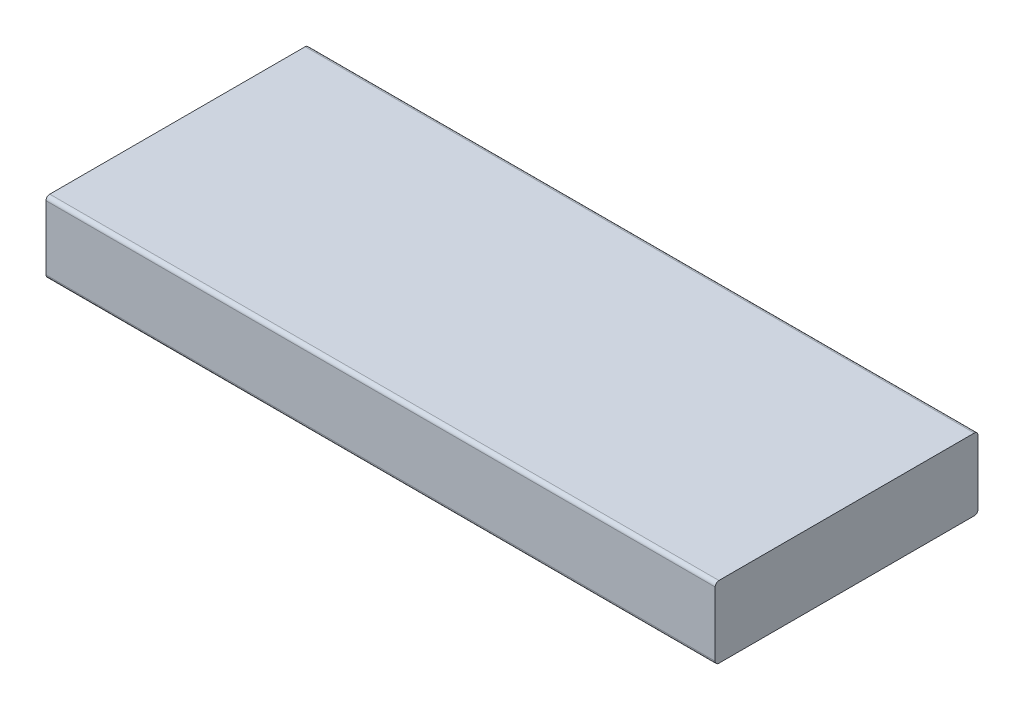
ISO-10303-21;
HEADER;
FILE_DESCRIPTION(('STEP AP214'),'2;1');
FILE_NAME('part.step','',(''),(''),'','','');
FILE_SCHEMA(('AUTOMOTIVE_DESIGN { 1 0 10303 214 1 1 1 1 }'));
ENDSEC;
DATA;
#1=APPLICATION_CONTEXT('core data for automotive mechanical design processes');
#2=APPLICATION_PROTOCOL_DEFINITION('international standard','automotive_design',2000,#1);
#3=PRODUCT_CONTEXT('',#1,'mechanical');
#4=PRODUCT('Part','Part','',(#3));
#5=PRODUCT_RELATED_PRODUCT_CATEGORY('part','',(#4));
#6=PRODUCT_DEFINITION_FORMATION('','',#4);
#7=PRODUCT_DEFINITION_CONTEXT('part definition',#1,'design');
#8=PRODUCT_DEFINITION('design','',#6,#7);
#9=PRODUCT_DEFINITION_SHAPE('','',#8);
#10=(LENGTH_UNIT() NAMED_UNIT(*) SI_UNIT(.MILLI.,.METRE.));
#11=(NAMED_UNIT(*) PLANE_ANGLE_UNIT() SI_UNIT($,.RADIAN.));
#12=(NAMED_UNIT(*) SI_UNIT($,.STERADIAN.) SOLID_ANGLE_UNIT());
#13=UNCERTAINTY_MEASURE_WITH_UNIT(LENGTH_MEASURE(1.E-05),#10,'distance_accuracy_value','');
#14=(GEOMETRIC_REPRESENTATION_CONTEXT(3) GLOBAL_UNCERTAINTY_ASSIGNED_CONTEXT((#13)) GLOBAL_UNIT_ASSIGNED_CONTEXT((#10,
#11,#12)) REPRESENTATION_CONTEXT('',''));
#15=CARTESIAN_POINT('',(0.,0.,0.));
#16=DIRECTION('',(0.,0.,1.));
#17=DIRECTION('',(1.,0.,0.));
#18=AXIS2_PLACEMENT_3D('',#15,#16,#17);
#19=CARTESIAN_POINT('',(355.6,-19.05,-69.85));
#20=DIRECTION('',(0.,0.,1.));
#21=DIRECTION('',(1.,0.,0.));
#22=AXIS2_PLACEMENT_3D('',#19,#20,#21);
#23=PLANE('',#22);
#24=DIRECTION('',(0.,1.,0.));
#25=VECTOR('',#24,1.);
#26=CARTESIAN_POINT('',(0.,-19.05,-69.85));
#27=LINE('',#26,#25);
#28=CARTESIAN_POINT('',(0.,-17.05,-69.85));
#29=VERTEX_POINT('',#28);
#30=CARTESIAN_POINT('',(0.,17.05,-69.85));
#31=VERTEX_POINT('',#30);
#32=EDGE_CURVE('E129',#29,#31,#27,.T.);
#33=ORIENTED_EDGE('',*,*,#32,.T.);
#34=DIRECTION('',(-1.,0.,0.));
#35=VECTOR('',#34,1.);
#36=CARTESIAN_POINT('',(355.6,17.05,-69.85));
#37=LINE('',#36,#35);
#38=CARTESIAN_POINT('',(355.6,17.05,-69.85));
#39=VERTEX_POINT('',#38);
#40=EDGE_CURVE('E152',#31,#39,#37,.F.);
#41=ORIENTED_EDGE('',*,*,#40,.T.);
#42=DIRECTION('',(0.,1.,0.));
#43=VECTOR('',#42,1.);
#44=CARTESIAN_POINT('',(355.6,-19.05,-69.85));
#45=LINE('',#44,#43);
#46=CARTESIAN_POINT('',(355.6,-17.05,-69.85));
#47=VERTEX_POINT('',#46);
#48=EDGE_CURVE('E127',#47,#39,#45,.T.);
#49=ORIENTED_EDGE('',*,*,#48,.F.);
#50=DIRECTION('',(-1.,0.,0.));
#51=VECTOR('',#50,1.);
#52=CARTESIAN_POINT('',(355.6,-17.05,-69.85));
#53=LINE('',#52,#51);
#54=EDGE_CURVE('E149',#47,#29,#53,.T.);
#55=ORIENTED_EDGE('',*,*,#54,.T.);
#56=EDGE_LOOP('',(#33,#41,#49,#55));
#57=FACE_BOUND('',#56,.T.);
#58=ADVANCED_FACE('F34',(#57),#23,.F.);
#59=CARTESIAN_POINT('',(355.6,19.05,69.85));
#60=DIRECTION('',(0.,-1.,0.));
#61=DIRECTION('',(0.,0.,-1.));
#62=AXIS2_PLACEMENT_3D('',#59,#60,#61);
#63=PLANE('',#62);
#64=DIRECTION('',(0.,0.,1.));
#65=VECTOR('',#64,1.);
#66=CARTESIAN_POINT('',(0.,19.05,69.85));
#67=LINE('',#66,#65);
#68=CARTESIAN_POINT('',(0.,19.05,-67.85));
#69=VERTEX_POINT('',#68);
#70=CARTESIAN_POINT('',(0.,19.05,67.85));
#71=VERTEX_POINT('',#70);
#72=EDGE_CURVE('E125',#69,#71,#67,.T.);
#73=ORIENTED_EDGE('',*,*,#72,.T.);
#74=DIRECTION('',(-1.,0.,0.));
#75=VECTOR('',#74,1.);
#76=CARTESIAN_POINT('',(355.6,19.05,67.85));
#77=LINE('',#76,#75);
#78=CARTESIAN_POINT('',(355.6,19.05,67.85));
#79=VERTEX_POINT('',#78);
#80=EDGE_CURVE('E104',#71,#79,#77,.F.);
#81=ORIENTED_EDGE('',*,*,#80,.T.);
#82=DIRECTION('',(0.,0.,1.));
#83=VECTOR('',#82,1.);
#84=CARTESIAN_POINT('',(355.6,19.05,69.85));
#85=LINE('',#84,#83);
#86=CARTESIAN_POINT('',(355.6,19.05,-67.85));
#87=VERTEX_POINT('',#86);
#88=EDGE_CURVE('E168',#87,#79,#85,.T.);
#89=ORIENTED_EDGE('',*,*,#88,.F.);
#90=DIRECTION('',(-1.,0.,0.));
#91=VECTOR('',#90,1.);
#92=CARTESIAN_POINT('',(355.6,19.05,-67.85));
#93=LINE('',#92,#91);
#94=EDGE_CURVE('E109',#87,#69,#93,.T.);
#95=ORIENTED_EDGE('',*,*,#94,.T.);
#96=EDGE_LOOP('',(#73,#81,#89,#95));
#97=FACE_BOUND('',#96,.T.);
#98=ADVANCED_FACE('F185',(#97),#63,.F.);
#99=CARTESIAN_POINT('',(355.6,-19.05,69.85));
#100=DIRECTION('',(0.,0.,-1.));
#101=DIRECTION('',(-1.,0.,0.));
#102=AXIS2_PLACEMENT_3D('',#99,#100,#101);
#103=PLANE('',#102);
#104=DIRECTION('',(0.,-1.,0.));
#105=VECTOR('',#104,1.);
#106=CARTESIAN_POINT('',(355.6,-19.05,69.85));
#107=LINE('',#106,#105);
#108=CARTESIAN_POINT('',(355.6,17.05,69.85));
#109=VERTEX_POINT('',#108);
#110=CARTESIAN_POINT('',(355.6,-17.05,69.85));
#111=VERTEX_POINT('',#110);
#112=EDGE_CURVE('E118',#109,#111,#107,.T.);
#113=ORIENTED_EDGE('',*,*,#112,.F.);
#114=DIRECTION('',(-1.,0.,0.));
#115=VECTOR('',#114,1.);
#116=CARTESIAN_POINT('',(355.6,17.05,69.85));
#117=LINE('',#116,#115);
#118=CARTESIAN_POINT('',(0.,17.05,69.85));
#119=VERTEX_POINT('',#118);
#120=EDGE_CURVE('E103',#109,#119,#117,.T.);
#121=ORIENTED_EDGE('',*,*,#120,.T.);
#122=DIRECTION('',(0.,-1.,0.));
#123=VECTOR('',#122,1.);
#124=CARTESIAN_POINT('',(0.,-19.05,69.85));
#125=LINE('',#124,#123);
#126=CARTESIAN_POINT('',(0.,-17.05,69.85));
#127=VERTEX_POINT('',#126);
#128=EDGE_CURVE('E116',#119,#127,#125,.T.);
#129=ORIENTED_EDGE('',*,*,#128,.T.);
#130=DIRECTION('',(-1.,0.,0.));
#131=VECTOR('',#130,1.);
#132=CARTESIAN_POINT('',(355.6,-17.05,69.85));
#133=LINE('',#132,#131);
#134=EDGE_CURVE('E120',#127,#111,#133,.F.);
#135=ORIENTED_EDGE('',*,*,#134,.T.);
#136=EDGE_LOOP('',(#113,#121,#129,#135));
#137=FACE_BOUND('',#136,.T.);
#138=ADVANCED_FACE('F115',(#137),#103,.F.);
#139=CARTESIAN_POINT('',(355.6,-19.05,69.85));
#140=DIRECTION('',(0.,1.,0.));
#141=DIRECTION('',(0.,0.,1.));
#142=AXIS2_PLACEMENT_3D('',#139,#140,#141);
#143=PLANE('',#142);
#144=DIRECTION('',(0.,0.,-1.));
#145=VECTOR('',#144,1.);
#146=CARTESIAN_POINT('',(0.,-19.05,69.85));
#147=LINE('',#146,#145);
#148=CARTESIAN_POINT('',(0.,-19.05,67.85));
#149=VERTEX_POINT('',#148);
#150=CARTESIAN_POINT('',(0.,-19.05,-67.85));
#151=VERTEX_POINT('',#150);
#152=EDGE_CURVE('E124',#149,#151,#147,.T.);
#153=ORIENTED_EDGE('',*,*,#152,.T.);
#154=DIRECTION('',(-1.,0.,0.));
#155=VECTOR('',#154,1.);
#156=CARTESIAN_POINT('',(355.6,-19.05,-67.85));
#157=LINE('',#156,#155);
#158=CARTESIAN_POINT('',(355.6,-19.05,-67.85));
#159=VERTEX_POINT('',#158);
#160=EDGE_CURVE('E11',#151,#159,#157,.F.);
#161=ORIENTED_EDGE('',*,*,#160,.T.);
#162=DIRECTION('',(0.,0.,-1.));
#163=VECTOR('',#162,1.);
#164=CARTESIAN_POINT('',(355.6,-19.05,69.85));
#165=LINE('',#164,#163);
#166=CARTESIAN_POINT('',(355.6,-19.05,67.85));
#167=VERTEX_POINT('',#166);
#168=EDGE_CURVE('E133',#167,#159,#165,.T.);
#169=ORIENTED_EDGE('',*,*,#168,.F.);
#170=DIRECTION('',(-1.,0.,0.));
#171=VECTOR('',#170,1.);
#172=CARTESIAN_POINT('',(355.6,-19.05,67.85));
#173=LINE('',#172,#171);
#174=EDGE_CURVE('E42',#167,#149,#173,.T.);
#175=ORIENTED_EDGE('',*,*,#174,.T.);
#176=EDGE_LOOP('',(#153,#161,#169,#175));
#177=FACE_BOUND('',#176,.T.);
#178=ADVANCED_FACE('F155',(#177),#143,.F.);
#179=CARTESIAN_POINT('',(355.6,0.,0.));
#180=DIRECTION('',(-1.,0.,0.));
#181=DIRECTION('',(0.,0.,1.));
#182=AXIS2_PLACEMENT_3D('',#179,#180,#181);
#183=PLANE('',#182);
#184=ORIENTED_EDGE('',*,*,#88,.T.);
#185=CARTESIAN_POINT('',(355.6,17.05,67.85));
#186=DIRECTION('',(-1.,0.,0.));
#187=DIRECTION('',(0.,0.,1.));
#188=AXIS2_PLACEMENT_3D('',#185,#186,#187);
#189=CIRCLE('',#188,2.);
#190=EDGE_CURVE('E147',#79,#109,#189,.F.);
#191=ORIENTED_EDGE('',*,*,#190,.T.);
#192=ORIENTED_EDGE('',*,*,#112,.T.);
#193=CARTESIAN_POINT('',(355.6,-17.05,67.85));
#194=DIRECTION('',(-1.,0.,0.));
#195=DIRECTION('',(0.,0.,1.));
#196=AXIS2_PLACEMENT_3D('',#193,#194,#195);
#197=CIRCLE('',#196,2.);
#198=EDGE_CURVE('E54',#111,#167,#197,.F.);
#199=ORIENTED_EDGE('',*,*,#198,.T.);
#200=ORIENTED_EDGE('',*,*,#168,.T.);
#201=CARTESIAN_POINT('',(355.6,-17.05,-67.85));
#202=DIRECTION('',(-1.,0.,0.));
#203=DIRECTION('',(0.,0.,1.));
#204=AXIS2_PLACEMENT_3D('',#201,#202,#203);
#205=CIRCLE('',#204,2.);
#206=EDGE_CURVE('E143',#159,#47,#205,.F.);
#207=ORIENTED_EDGE('',*,*,#206,.T.);
#208=ORIENTED_EDGE('',*,*,#48,.T.);
#209=CARTESIAN_POINT('',(355.6,17.05,-67.85));
#210=DIRECTION('',(-1.,0.,0.));
#211=DIRECTION('',(0.,0.,1.));
#212=AXIS2_PLACEMENT_3D('',#209,#210,#211);
#213=CIRCLE('',#212,2.);
#214=EDGE_CURVE('E145',#39,#87,#213,.F.);
#215=ORIENTED_EDGE('',*,*,#214,.T.);
#216=EDGE_LOOP('',(#184,#191,#192,#199,#200,#207,#208,#215));
#217=FACE_BOUND('',#216,.T.);
#218=ADVANCED_FACE('F174',(#217),#183,.F.);
#219=CARTESIAN_POINT('',(0.,0.,0.));
#220=DIRECTION('',(-1.,0.,0.));
#221=DIRECTION('',(0.,0.,1.));
#222=AXIS2_PLACEMENT_3D('',#219,#220,#221);
#223=PLANE('',#222);
#224=ORIENTED_EDGE('',*,*,#128,.F.);
#225=CARTESIAN_POINT('',(0.,17.05,67.85));
#226=DIRECTION('',(-1.,0.,0.));
#227=DIRECTION('',(0.,0.,1.));
#228=AXIS2_PLACEMENT_3D('',#225,#226,#227);
#229=CIRCLE('',#228,2.);
#230=EDGE_CURVE('E99',#119,#71,#229,.T.);
#231=ORIENTED_EDGE('',*,*,#230,.T.);
#232=ORIENTED_EDGE('',*,*,#72,.F.);
#233=CARTESIAN_POINT('',(0.,17.05,-67.85));
#234=DIRECTION('',(-1.,0.,0.));
#235=DIRECTION('',(0.,0.,1.));
#236=AXIS2_PLACEMENT_3D('',#233,#234,#235);
#237=CIRCLE('',#236,2.);
#238=EDGE_CURVE('E110',#69,#31,#237,.T.);
#239=ORIENTED_EDGE('',*,*,#238,.T.);
#240=ORIENTED_EDGE('',*,*,#32,.F.);
#241=CARTESIAN_POINT('',(0.,-17.05,-67.85));
#242=DIRECTION('',(-1.,0.,0.));
#243=DIRECTION('',(0.,0.,1.));
#244=AXIS2_PLACEMENT_3D('',#241,#242,#243);
#245=CIRCLE('',#244,2.);
#246=EDGE_CURVE('E136',#29,#151,#245,.T.);
#247=ORIENTED_EDGE('',*,*,#246,.T.);
#248=ORIENTED_EDGE('',*,*,#152,.F.);
#249=CARTESIAN_POINT('',(0.,-17.05,67.85));
#250=DIRECTION('',(-1.,0.,0.));
#251=DIRECTION('',(0.,0.,1.));
#252=AXIS2_PLACEMENT_3D('',#249,#250,#251);
#253=CIRCLE('',#252,2.);
#254=EDGE_CURVE('E119',#149,#127,#253,.T.);
#255=ORIENTED_EDGE('',*,*,#254,.T.);
#256=EDGE_LOOP('',(#224,#231,#232,#239,#240,#247,#248,#255));
#257=FACE_BOUND('',#256,.T.);
#258=ADVANCED_FACE('F122',(#257),#223,.T.);
#259=CARTESIAN_POINT('',(355.6,17.05,67.85));
#260=DIRECTION('',(-1.,0.,0.));
#261=DIRECTION('',(0.,0.,1.));
#262=AXIS2_PLACEMENT_3D('',#259,#260,#261);
#263=CYLINDRICAL_SURFACE('',#262,2.);
#264=ORIENTED_EDGE('',*,*,#190,.F.);
#265=ORIENTED_EDGE('',*,*,#80,.F.);
#266=ORIENTED_EDGE('',*,*,#230,.F.);
#267=ORIENTED_EDGE('',*,*,#120,.F.);
#268=EDGE_LOOP('',(#264,#265,#266,#267));
#269=FACE_BOUND('',#268,.T.);
#270=ADVANCED_FACE('F102',(#269),#263,.T.);
#271=CARTESIAN_POINT('',(355.6,17.05,-67.85));
#272=DIRECTION('',(-1.,0.,0.));
#273=DIRECTION('',(0.,0.,1.));
#274=AXIS2_PLACEMENT_3D('',#271,#272,#273);
#275=CYLINDRICAL_SURFACE('',#274,2.);
#276=ORIENTED_EDGE('',*,*,#214,.F.);
#277=ORIENTED_EDGE('',*,*,#40,.F.);
#278=ORIENTED_EDGE('',*,*,#238,.F.);
#279=ORIENTED_EDGE('',*,*,#94,.F.);
#280=EDGE_LOOP('',(#276,#277,#278,#279));
#281=FACE_BOUND('',#280,.T.);
#282=ADVANCED_FACE('F196',(#281),#275,.T.);
#283=CARTESIAN_POINT('',(355.6,-17.05,-67.85));
#284=DIRECTION('',(-1.,0.,0.));
#285=DIRECTION('',(0.,0.,1.));
#286=AXIS2_PLACEMENT_3D('',#283,#284,#285);
#287=CYLINDRICAL_SURFACE('',#286,2.);
#288=ORIENTED_EDGE('',*,*,#206,.F.);
#289=ORIENTED_EDGE('',*,*,#160,.F.);
#290=ORIENTED_EDGE('',*,*,#246,.F.);
#291=ORIENTED_EDGE('',*,*,#54,.F.);
#292=EDGE_LOOP('',(#288,#289,#290,#291));
#293=FACE_BOUND('',#292,.T.);
#294=ADVANCED_FACE('F162',(#293),#287,.T.);
#295=CARTESIAN_POINT('',(355.6,-17.05,67.85));
#296=DIRECTION('',(-1.,0.,0.));
#297=DIRECTION('',(0.,0.,1.));
#298=AXIS2_PLACEMENT_3D('',#295,#296,#297);
#299=CYLINDRICAL_SURFACE('',#298,2.);
#300=ORIENTED_EDGE('',*,*,#198,.F.);
#301=ORIENTED_EDGE('',*,*,#134,.F.);
#302=ORIENTED_EDGE('',*,*,#254,.F.);
#303=ORIENTED_EDGE('',*,*,#174,.F.);
#304=EDGE_LOOP('',(#300,#301,#302,#303));
#305=FACE_BOUND('',#304,.T.);
#306=ADVANCED_FACE('F36',(#305),#299,.T.);
#307=CLOSED_SHELL('',(#58,#98,#138,#178,#218,#258,#270,#282,#294,#306));
#308=MANIFOLD_SOLID_BREP('B2',#307);
#309=ADVANCED_BREP_SHAPE_REPRESENTATION('',(#18,#308),#14);
#310=SHAPE_DEFINITION_REPRESENTATION(#9,#309);
ENDSEC;
END-ISO-10303-21;
